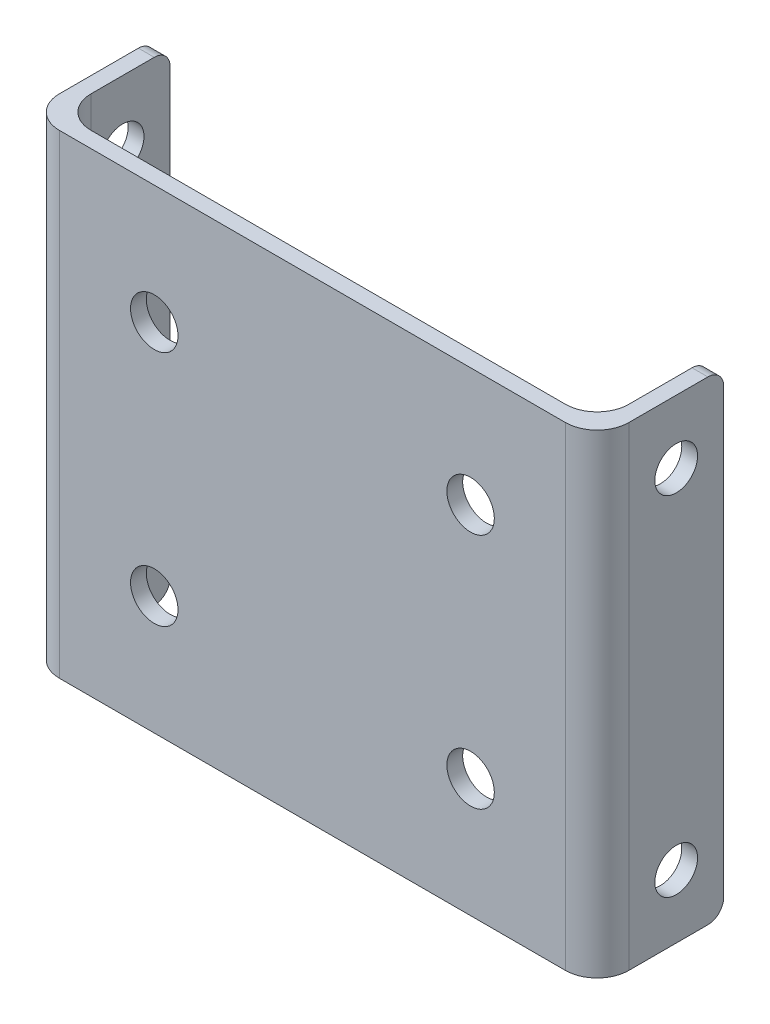
ISO-10303-21;
HEADER;
FILE_DESCRIPTION(('STEP AP214'),'2;1');
FILE_NAME('part.step','',(''),(''),'','','');
FILE_SCHEMA(('AUTOMOTIVE_DESIGN { 1 0 10303 214 1 1 1 1 }'));
ENDSEC;
DATA;
#1=APPLICATION_CONTEXT('core data for automotive mechanical design processes');
#2=APPLICATION_PROTOCOL_DEFINITION('international standard','automotive_design',2000,#1);
#3=PRODUCT_CONTEXT('',#1,'mechanical');
#4=PRODUCT('Part','Part','',(#3));
#5=PRODUCT_RELATED_PRODUCT_CATEGORY('part','',(#4));
#6=PRODUCT_DEFINITION_FORMATION('','',#4);
#7=PRODUCT_DEFINITION_CONTEXT('part definition',#1,'design');
#8=PRODUCT_DEFINITION('design','',#6,#7);
#9=PRODUCT_DEFINITION_SHAPE('','',#8);
#10=(LENGTH_UNIT() NAMED_UNIT(*) SI_UNIT(.MILLI.,.METRE.));
#11=(NAMED_UNIT(*) PLANE_ANGLE_UNIT() SI_UNIT($,.RADIAN.));
#12=(NAMED_UNIT(*) SI_UNIT($,.STERADIAN.) SOLID_ANGLE_UNIT());
#13=UNCERTAINTY_MEASURE_WITH_UNIT(LENGTH_MEASURE(1.E-05),#10,'distance_accuracy_value','');
#14=(GEOMETRIC_REPRESENTATION_CONTEXT(3) GLOBAL_UNCERTAINTY_ASSIGNED_CONTEXT((#13)) GLOBAL_UNIT_ASSIGNED_CONTEXT((#10,
#11,#12)) REPRESENTATION_CONTEXT('',''));
#15=CARTESIAN_POINT('',(0.,0.,0.));
#16=DIRECTION('',(0.,0.,1.));
#17=DIRECTION('',(1.,0.,0.));
#18=AXIS2_PLACEMENT_3D('',#15,#16,#17);
#19=CARTESIAN_POINT('',(13.5000000000001,30.,-0.5));
#20=DIRECTION('',(-1.,0.,0.));
#21=DIRECTION('',(0.,0.,1.));
#22=AXIS2_PLACEMENT_3D('',#19,#20,#21);
#23=PLANE('',#22);
#24=CARTESIAN_POINT('',(13.5000000000001,4.,-4.5));
#25=DIRECTION('',(1.,0.,0.));
#26=DIRECTION('',(0.,0.,-1.));
#27=AXIS2_PLACEMENT_3D('',#24,#25,#26);
#28=CIRCLE('',#27,1.35);
#29=CARTESIAN_POINT('',(13.5000000000001,4.,-5.85));
#30=VERTEX_POINT('',#29);
#31=EDGE_CURVE('E448',#30,#30,#28,.T.);
#32=ORIENTED_EDGE('',*,*,#31,.F.);
#33=EDGE_LOOP('',(#32));
#34=FACE_BOUND('',#33,.T.);
#35=CARTESIAN_POINT('',(13.5000000000001,26.,-4.5));
#36=DIRECTION('',(1.,0.,0.));
#37=DIRECTION('',(0.,0.,-1.));
#38=AXIS2_PLACEMENT_3D('',#35,#36,#37);
#39=CIRCLE('',#38,1.35);
#40=CARTESIAN_POINT('',(13.5000000000001,26.,-5.85));
#41=VERTEX_POINT('',#40);
#42=EDGE_CURVE('E449',#41,#41,#39,.T.);
#43=ORIENTED_EDGE('',*,*,#42,.F.);
#44=EDGE_LOOP('',(#43));
#45=FACE_BOUND('',#44,.T.);
#46=DIRECTION('',(0.,0.,-1.));
#47=VECTOR('',#46,1.);
#48=CARTESIAN_POINT('',(13.5000000000001,0.,-0.5));
#49=LINE('',#48,#47);
#50=CARTESIAN_POINT('',(13.5000000000001,0.,-1.5));
#51=VERTEX_POINT('',#50);
#52=CARTESIAN_POINT('',(13.5000000000001,0.,-6.5));
#53=VERTEX_POINT('',#52);
#54=EDGE_CURVE('E275',#51,#53,#49,.T.);
#55=ORIENTED_EDGE('',*,*,#54,.T.);
#56=CARTESIAN_POINT('',(13.5000000000001,1.,-6.5));
#57=DIRECTION('',(-1.,0.,0.));
#58=DIRECTION('',(0.,0.,1.));
#59=AXIS2_PLACEMENT_3D('',#56,#57,#58);
#60=CIRCLE('',#59,1.);
#61=CARTESIAN_POINT('',(13.5000000000001,1.,-7.5));
#62=VERTEX_POINT('',#61);
#63=EDGE_CURVE('E11',#53,#62,#60,.F.);
#64=ORIENTED_EDGE('',*,*,#63,.T.);
#65=DIRECTION('',(0.,-1.,0.));
#66=VECTOR('',#65,1.);
#67=CARTESIAN_POINT('',(13.5000000000001,30.,-7.5));
#68=LINE('',#67,#66);
#69=CARTESIAN_POINT('',(13.5000000000001,29.,-7.5));
#70=VERTEX_POINT('',#69);
#71=EDGE_CURVE('E191',#70,#62,#68,.T.);
#72=ORIENTED_EDGE('',*,*,#71,.F.);
#73=CARTESIAN_POINT('',(13.5000000000001,29.,-6.5));
#74=DIRECTION('',(-1.,0.,0.));
#75=DIRECTION('',(0.,0.,1.));
#76=AXIS2_PLACEMENT_3D('',#73,#74,#75);
#77=CIRCLE('',#76,1.);
#78=CARTESIAN_POINT('',(13.5000000000001,30.,-6.5));
#79=VERTEX_POINT('',#78);
#80=EDGE_CURVE('E42',#70,#79,#77,.F.);
#81=ORIENTED_EDGE('',*,*,#80,.T.);
#82=DIRECTION('',(0.,0.,-1.));
#83=VECTOR('',#82,1.);
#84=CARTESIAN_POINT('',(13.5000000000001,30.,-0.5));
#85=LINE('',#84,#83);
#86=CARTESIAN_POINT('',(13.5000000000001,30.,-1.5));
#87=VERTEX_POINT('',#86);
#88=EDGE_CURVE('E172',#87,#79,#85,.T.);
#89=ORIENTED_EDGE('',*,*,#88,.F.);
#90=DIRECTION('',(0.,-1.,0.));
#91=VECTOR('',#90,1.);
#92=CARTESIAN_POINT('',(13.5000000000001,30.,-1.5));
#93=LINE('',#92,#91);
#94=EDGE_CURVE('E208',#87,#51,#93,.T.);
#95=ORIENTED_EDGE('',*,*,#94,.T.);
#96=EDGE_LOOP('',(#55,#64,#72,#81,#89,#95));
#97=FACE_BOUND('',#96,.T.);
#98=ADVANCED_FACE('F34',(#34,#45,#97),#23,.F.);
#99=CARTESIAN_POINT('',(13.5000000000001,30.,-7.5));
#100=DIRECTION('',(0.,0.,1.));
#101=DIRECTION('',(1.,0.,0.));
#102=AXIS2_PLACEMENT_3D('',#99,#100,#101);
#103=PLANE('',#102);
#104=ORIENTED_EDGE('',*,*,#71,.T.);
#105=DIRECTION('',(-1.,0.,0.));
#106=VECTOR('',#105,1.);
#107=CARTESIAN_POINT('',(13.5000000000001,1.,-7.5));
#108=LINE('',#107,#106);
#109=CARTESIAN_POINT('',(12.5000000000001,1.,-7.5));
#110=VERTEX_POINT('',#109);
#111=EDGE_CURVE('E247',#62,#110,#108,.T.);
#112=ORIENTED_EDGE('',*,*,#111,.T.);
#113=DIRECTION('',(0.,-1.,0.));
#114=VECTOR('',#113,1.);
#115=CARTESIAN_POINT('',(12.5000000000001,30.,-7.5));
#116=LINE('',#115,#114);
#117=CARTESIAN_POINT('',(12.5000000000001,29.,-7.5));
#118=VERTEX_POINT('',#117);
#119=EDGE_CURVE('E188',#118,#110,#116,.T.);
#120=ORIENTED_EDGE('',*,*,#119,.F.);
#121=DIRECTION('',(-1.,0.,0.));
#122=VECTOR('',#121,1.);
#123=CARTESIAN_POINT('',(13.5000000000001,29.,-7.5));
#124=LINE('',#123,#122);
#125=EDGE_CURVE('E54',#118,#70,#124,.F.);
#126=ORIENTED_EDGE('',*,*,#125,.T.);
#127=EDGE_LOOP('',(#104,#112,#120,#126));
#128=FACE_BOUND('',#127,.T.);
#129=ADVANCED_FACE('F265',(#128),#103,.F.);
#130=CARTESIAN_POINT('',(12.5000000000001,30.,-0.5));
#131=DIRECTION('',(1.,0.,0.));
#132=DIRECTION('',(0.,0.,-1.));
#133=AXIS2_PLACEMENT_3D('',#130,#131,#132);
#134=PLANE('',#133);
#135=CARTESIAN_POINT('',(12.5000000000001,4.,-4.5));
#136=DIRECTION('',(1.,0.,0.));
#137=DIRECTION('',(0.,0.,-1.));
#138=AXIS2_PLACEMENT_3D('',#135,#136,#137);
#139=CIRCLE('',#138,1.35);
#140=CARTESIAN_POINT('',(12.5000000000001,4.,-5.85));
#141=VERTEX_POINT('',#140);
#142=EDGE_CURVE('E372',#141,#141,#139,.T.);
#143=ORIENTED_EDGE('',*,*,#142,.T.);
#144=EDGE_LOOP('',(#143));
#145=FACE_BOUND('',#144,.T.);
#146=CARTESIAN_POINT('',(12.5000000000001,26.,-4.5));
#147=DIRECTION('',(1.,0.,0.));
#148=DIRECTION('',(0.,0.,-1.));
#149=AXIS2_PLACEMENT_3D('',#146,#147,#148);
#150=CIRCLE('',#149,1.35);
#151=CARTESIAN_POINT('',(12.5000000000001,26.,-5.85));
#152=VERTEX_POINT('',#151);
#153=EDGE_CURVE('E375',#152,#152,#150,.T.);
#154=ORIENTED_EDGE('',*,*,#153,.T.);
#155=EDGE_LOOP('',(#154));
#156=FACE_BOUND('',#155,.T.);
#157=ORIENTED_EDGE('',*,*,#119,.T.);
#158=CARTESIAN_POINT('',(12.5000000000001,1.,-6.5));
#159=DIRECTION('',(1.,0.,0.));
#160=DIRECTION('',(0.,0.,-1.));
#161=AXIS2_PLACEMENT_3D('',#158,#159,#160);
#162=CIRCLE('',#161,1.);
#163=CARTESIAN_POINT('',(12.5000000000001,0.,-6.5));
#164=VERTEX_POINT('',#163);
#165=EDGE_CURVE('E252',#110,#164,#162,.F.);
#166=ORIENTED_EDGE('',*,*,#165,.T.);
#167=DIRECTION('',(0.,0.,1.));
#168=VECTOR('',#167,1.);
#169=CARTESIAN_POINT('',(12.5000000000001,0.,-0.5));
#170=LINE('',#169,#168);
#171=CARTESIAN_POINT('',(12.5000000000001,0.,-2.5));
#172=VERTEX_POINT('',#171);
#173=EDGE_CURVE('E271',#164,#172,#170,.T.);
#174=ORIENTED_EDGE('',*,*,#173,.T.);
#175=DIRECTION('',(0.,-1.,0.));
#176=VECTOR('',#175,1.);
#177=CARTESIAN_POINT('',(12.5000000000001,30.,-2.5));
#178=LINE('',#177,#176);
#179=CARTESIAN_POINT('',(12.5000000000001,30.,-2.5));
#180=VERTEX_POINT('',#179);
#181=EDGE_CURVE('E211',#172,#180,#178,.F.);
#182=ORIENTED_EDGE('',*,*,#181,.T.);
#183=DIRECTION('',(0.,0.,1.));
#184=VECTOR('',#183,1.);
#185=CARTESIAN_POINT('',(12.5000000000001,30.,-0.5));
#186=LINE('',#185,#184);
#187=CARTESIAN_POINT('',(12.5000000000001,30.,-6.5));
#188=VERTEX_POINT('',#187);
#189=EDGE_CURVE('E176',#188,#180,#186,.T.);
#190=ORIENTED_EDGE('',*,*,#189,.F.);
#191=CARTESIAN_POINT('',(12.5000000000001,29.,-6.5));
#192=DIRECTION('',(1.,0.,0.));
#193=DIRECTION('',(0.,0.,-1.));
#194=AXIS2_PLACEMENT_3D('',#191,#192,#193);
#195=CIRCLE('',#194,1.);
#196=EDGE_CURVE('E250',#188,#118,#195,.F.);
#197=ORIENTED_EDGE('',*,*,#196,.T.);
#198=EDGE_LOOP('',(#157,#166,#174,#182,#190,#197));
#199=FACE_BOUND('',#198,.T.);
#200=ADVANCED_FACE('F264',(#145,#156,#199),#134,.F.);
#201=CARTESIAN_POINT('',(-21.4999999999999,30.,-0.500000000000001));
#202=DIRECTION('',(0.,0.,1.));
#203=DIRECTION('',(1.,0.,0.));
#204=AXIS2_PLACEMENT_3D('',#201,#202,#203);
#205=PLANE('',#204);
#206=CARTESIAN_POINT('',(-14.4999999999999,7.5,-0.500000000000001));
#207=DIRECTION('',(0.,0.,1.));
#208=DIRECTION('',(1.,0.,0.));
#209=AXIS2_PLACEMENT_3D('',#206,#207,#208);
#210=CIRCLE('',#209,1.5);
#211=CARTESIAN_POINT('',(-12.9999999999999,7.5,-0.500000000000001));
#212=VERTEX_POINT('',#211);
#213=EDGE_CURVE('E381',#212,#212,#210,.T.);
#214=ORIENTED_EDGE('',*,*,#213,.T.);
#215=EDGE_LOOP('',(#214));
#216=FACE_BOUND('',#215,.T.);
#217=CARTESIAN_POINT('',(5.50000000000006,7.5,-0.5));
#218=DIRECTION('',(0.,0.,1.));
#219=DIRECTION('',(1.,0.,0.));
#220=AXIS2_PLACEMENT_3D('',#217,#218,#219);
#221=CIRCLE('',#220,1.5);
#222=CARTESIAN_POINT('',(7.00000000000006,7.5,-0.5));
#223=VERTEX_POINT('',#222);
#224=EDGE_CURVE('E393',#223,#223,#221,.T.);
#225=ORIENTED_EDGE('',*,*,#224,.T.);
#226=EDGE_LOOP('',(#225));
#227=FACE_BOUND('',#226,.T.);
#228=CARTESIAN_POINT('',(5.50000000000006,22.5,-0.5));
#229=DIRECTION('',(0.,0.,1.));
#230=DIRECTION('',(1.,0.,0.));
#231=AXIS2_PLACEMENT_3D('',#228,#229,#230);
#232=CIRCLE('',#231,1.5);
#233=CARTESIAN_POINT('',(7.00000000000005,22.5,-0.5));
#234=VERTEX_POINT('',#233);
#235=EDGE_CURVE('E399',#234,#234,#232,.T.);
#236=ORIENTED_EDGE('',*,*,#235,.T.);
#237=EDGE_LOOP('',(#236));
#238=FACE_BOUND('',#237,.T.);
#239=CARTESIAN_POINT('',(-14.4999999999999,22.5,-0.500000000000001));
#240=DIRECTION('',(0.,0.,1.));
#241=DIRECTION('',(1.,0.,0.));
#242=AXIS2_PLACEMENT_3D('',#239,#240,#241);
#243=CIRCLE('',#242,1.5);
#244=CARTESIAN_POINT('',(-12.9999999999999,22.5,-0.500000000000001));
#245=VERTEX_POINT('',#244);
#246=EDGE_CURVE('E279',#245,#245,#243,.T.);
#247=ORIENTED_EDGE('',*,*,#246,.T.);
#248=EDGE_LOOP('',(#247));
#249=FACE_BOUND('',#248,.T.);
#250=DIRECTION('',(-1.,0.,0.));
#251=VECTOR('',#250,1.);
#252=CARTESIAN_POINT('',(-21.4999999999999,0.,-0.500000000000001));
#253=LINE('',#252,#251);
#254=CARTESIAN_POINT('',(10.5000000000001,0.,-0.5));
#255=VERTEX_POINT('',#254);
#256=CARTESIAN_POINT('',(-19.4999999999999,0.,-0.500000000000001));
#257=VERTEX_POINT('',#256);
#258=EDGE_CURVE('E274',#255,#257,#253,.T.);
#259=ORIENTED_EDGE('',*,*,#258,.T.);
#260=DIRECTION('',(0.,-1.,0.));
#261=VECTOR('',#260,1.);
#262=CARTESIAN_POINT('',(-19.4999999999999,30.,-0.500000000000001));
#263=LINE('',#262,#261);
#264=CARTESIAN_POINT('',(-19.4999999999999,30.,-0.500000000000001));
#265=VERTEX_POINT('',#264);
#266=EDGE_CURVE('E206',#257,#265,#263,.F.);
#267=ORIENTED_EDGE('',*,*,#266,.T.);
#268=DIRECTION('',(-1.,0.,0.));
#269=VECTOR('',#268,1.);
#270=CARTESIAN_POINT('',(-21.4999999999999,30.,-0.500000000000001));
#271=LINE('',#270,#269);
#272=CARTESIAN_POINT('',(10.5000000000001,30.,-0.5));
#273=VERTEX_POINT('',#272);
#274=EDGE_CURVE('E309',#273,#265,#271,.T.);
#275=ORIENTED_EDGE('',*,*,#274,.F.);
#276=DIRECTION('',(0.,-1.,0.));
#277=VECTOR('',#276,1.);
#278=CARTESIAN_POINT('',(10.5000000000001,0.,-0.5));
#279=LINE('',#278,#277);
#280=EDGE_CURVE('E203',#273,#255,#279,.T.);
#281=ORIENTED_EDGE('',*,*,#280,.T.);
#282=EDGE_LOOP('',(#259,#267,#275,#281));
#283=FACE_BOUND('',#282,.T.);
#284=ADVANCED_FACE('F361',(#216,#227,#238,#249,#283),#205,.F.);
#285=CARTESIAN_POINT('',(-21.4999999999999,30.,-0.500000000000001));
#286=DIRECTION('',(-1.,0.,0.));
#287=DIRECTION('',(0.,0.,1.));
#288=AXIS2_PLACEMENT_3D('',#285,#286,#287);
#289=PLANE('',#288);
#290=CARTESIAN_POINT('',(-21.4999999999999,4.,-4.5));
#291=DIRECTION('',(-1.,0.,0.));
#292=DIRECTION('',(0.,0.,1.));
#293=AXIS2_PLACEMENT_3D('',#290,#291,#292);
#294=CIRCLE('',#293,1.35);
#295=CARTESIAN_POINT('',(-21.4999999999999,4.,-3.15));
#296=VERTEX_POINT('',#295);
#297=EDGE_CURVE('E450',#296,#296,#294,.T.);
#298=ORIENTED_EDGE('',*,*,#297,.T.);
#299=EDGE_LOOP('',(#298));
#300=FACE_BOUND('',#299,.T.);
#301=CARTESIAN_POINT('',(-21.4999999999999,26.,-4.5));
#302=DIRECTION('',(-1.,0.,0.));
#303=DIRECTION('',(0.,0.,1.));
#304=AXIS2_PLACEMENT_3D('',#301,#302,#303);
#305=CIRCLE('',#304,1.35);
#306=CARTESIAN_POINT('',(-21.4999999999999,26.,-3.15));
#307=VERTEX_POINT('',#306);
#308=EDGE_CURVE('E378',#307,#307,#305,.T.);
#309=ORIENTED_EDGE('',*,*,#308,.T.);
#310=EDGE_LOOP('',(#309));
#311=FACE_BOUND('',#310,.T.);
#312=DIRECTION('',(0.,-1.,0.));
#313=VECTOR('',#312,1.);
#314=CARTESIAN_POINT('',(-21.4999999999999,30.,-7.5));
#315=LINE('',#314,#313);
#316=CARTESIAN_POINT('',(-21.4999999999999,29.,-7.5));
#317=VERTEX_POINT('',#316);
#318=CARTESIAN_POINT('',(-21.4999999999999,1.,-7.5));
#319=VERTEX_POINT('',#318);
#320=EDGE_CURVE('E185',#317,#319,#315,.T.);
#321=ORIENTED_EDGE('',*,*,#320,.F.);
#322=CARTESIAN_POINT('',(-21.4999999999999,29.,-6.5));
#323=DIRECTION('',(-1.,0.,0.));
#324=DIRECTION('',(0.,0.,1.));
#325=AXIS2_PLACEMENT_3D('',#322,#323,#324);
#326=CIRCLE('',#325,1.);
#327=CARTESIAN_POINT('',(-21.4999999999999,30.,-6.49999999999999));
#328=VERTEX_POINT('',#327);
#329=EDGE_CURVE('E240',#317,#328,#326,.F.);
#330=ORIENTED_EDGE('',*,*,#329,.T.);
#331=DIRECTION('',(0.,0.,-1.));
#332=VECTOR('',#331,1.);
#333=CARTESIAN_POINT('',(-21.4999999999999,30.,-0.500000000000001));
#334=LINE('',#333,#332);
#335=CARTESIAN_POINT('',(-21.4999999999999,30.,-2.5));
#336=VERTEX_POINT('',#335);
#337=EDGE_CURVE('E306',#336,#328,#334,.T.);
#338=ORIENTED_EDGE('',*,*,#337,.F.);
#339=DIRECTION('',(0.,-1.,0.));
#340=VECTOR('',#339,1.);
#341=CARTESIAN_POINT('',(-21.4999999999999,0.,-2.5));
#342=LINE('',#341,#340);
#343=CARTESIAN_POINT('',(-21.4999999999999,0.,-2.5));
#344=VERTEX_POINT('',#343);
#345=EDGE_CURVE('E200',#336,#344,#342,.T.);
#346=ORIENTED_EDGE('',*,*,#345,.T.);
#347=DIRECTION('',(0.,0.,-1.));
#348=VECTOR('',#347,1.);
#349=CARTESIAN_POINT('',(-21.4999999999999,0.,-0.500000000000001));
#350=LINE('',#349,#348);
#351=CARTESIAN_POINT('',(-21.4999999999999,0.,-6.49999999999999));
#352=VERTEX_POINT('',#351);
#353=EDGE_CURVE('E178',#344,#352,#350,.T.);
#354=ORIENTED_EDGE('',*,*,#353,.T.);
#355=CARTESIAN_POINT('',(-21.4999999999999,1.,-6.5));
#356=DIRECTION('',(-1.,0.,0.));
#357=DIRECTION('',(0.,0.,1.));
#358=AXIS2_PLACEMENT_3D('',#355,#356,#357);
#359=CIRCLE('',#358,1.);
#360=EDGE_CURVE('E238',#352,#319,#359,.F.);
#361=ORIENTED_EDGE('',*,*,#360,.T.);
#362=EDGE_LOOP('',(#321,#330,#338,#346,#354,#361));
#363=FACE_BOUND('',#362,.T.);
#364=ADVANCED_FACE('F287',(#300,#311,#363),#289,.F.);
#365=CARTESIAN_POINT('',(-22.4999999999999,30.,-7.5));
#366=DIRECTION('',(0.,0.,1.));
#367=DIRECTION('',(1.,0.,0.));
#368=AXIS2_PLACEMENT_3D('',#365,#366,#367);
#369=PLANE('',#368);
#370=DIRECTION('',(0.,-1.,0.));
#371=VECTOR('',#370,1.);
#372=CARTESIAN_POINT('',(-22.4999999999999,30.,-7.5));
#373=LINE('',#372,#371);
#374=CARTESIAN_POINT('',(-22.4999999999999,29.,-7.5));
#375=VERTEX_POINT('',#374);
#376=CARTESIAN_POINT('',(-22.4999999999999,1.,-7.5));
#377=VERTEX_POINT('',#376);
#378=EDGE_CURVE('E182',#375,#377,#373,.T.);
#379=ORIENTED_EDGE('',*,*,#378,.F.);
#380=DIRECTION('',(-1.,0.,0.));
#381=VECTOR('',#380,1.);
#382=CARTESIAN_POINT('',(-21.4999999999999,29.,-7.5));
#383=LINE('',#382,#381);
#384=EDGE_CURVE('E236',#375,#317,#383,.F.);
#385=ORIENTED_EDGE('',*,*,#384,.T.);
#386=ORIENTED_EDGE('',*,*,#320,.T.);
#387=DIRECTION('',(-1.,0.,0.));
#388=VECTOR('',#387,1.);
#389=CARTESIAN_POINT('',(-22.4999999999999,1.,-7.5));
#390=LINE('',#389,#388);
#391=EDGE_CURVE('E233',#319,#377,#390,.T.);
#392=ORIENTED_EDGE('',*,*,#391,.T.);
#393=EDGE_LOOP('',(#379,#385,#386,#392));
#394=FACE_BOUND('',#393,.T.);
#395=ADVANCED_FACE('F296',(#394),#369,.F.);
#396=CARTESIAN_POINT('',(-22.4999999999999,30.,-0.499999999999996));
#397=DIRECTION('',(1.,0.,0.));
#398=DIRECTION('',(0.,0.,-1.));
#399=AXIS2_PLACEMENT_3D('',#396,#397,#398);
#400=PLANE('',#399);
#401=CARTESIAN_POINT('',(-22.4999999999999,4.,-4.5));
#402=DIRECTION('',(1.,0.,0.));
#403=DIRECTION('',(0.,0.,-1.));
#404=AXIS2_PLACEMENT_3D('',#401,#402,#403);
#405=CIRCLE('',#404,1.35);
#406=CARTESIAN_POINT('',(-22.4999999999999,4.,-5.85));
#407=VERTEX_POINT('',#406);
#408=EDGE_CURVE('E454',#407,#407,#405,.T.);
#409=ORIENTED_EDGE('',*,*,#408,.T.);
#410=EDGE_LOOP('',(#409));
#411=FACE_BOUND('',#410,.T.);
#412=CARTESIAN_POINT('',(-22.4999999999999,26.,-4.5));
#413=DIRECTION('',(1.,0.,0.));
#414=DIRECTION('',(0.,0.,-1.));
#415=AXIS2_PLACEMENT_3D('',#412,#413,#414);
#416=CIRCLE('',#415,1.35);
#417=CARTESIAN_POINT('',(-22.4999999999999,26.,-5.85));
#418=VERTEX_POINT('',#417);
#419=EDGE_CURVE('E384',#418,#418,#416,.T.);
#420=ORIENTED_EDGE('',*,*,#419,.T.);
#421=EDGE_LOOP('',(#420));
#422=FACE_BOUND('',#421,.T.);
#423=DIRECTION('',(0.,0.,1.));
#424=VECTOR('',#423,1.);
#425=CARTESIAN_POINT('',(-22.4999999999999,30.,-0.499999999999996));
#426=LINE('',#425,#424);
#427=CARTESIAN_POINT('',(-22.4999999999999,30.,-6.5));
#428=VERTEX_POINT('',#427);
#429=CARTESIAN_POINT('',(-22.4999999999999,30.,-1.5));
#430=VERTEX_POINT('',#429);
#431=EDGE_CURVE('E301',#428,#430,#426,.T.);
#432=ORIENTED_EDGE('',*,*,#431,.F.);
#433=CARTESIAN_POINT('',(-22.4999999999999,29.,-6.5));
#434=DIRECTION('',(1.,0.,0.));
#435=DIRECTION('',(0.,0.,-1.));
#436=AXIS2_PLACEMENT_3D('',#433,#434,#435);
#437=CIRCLE('',#436,1.);
#438=EDGE_CURVE('E231',#428,#375,#437,.F.);
#439=ORIENTED_EDGE('',*,*,#438,.T.);
#440=ORIENTED_EDGE('',*,*,#378,.T.);
#441=CARTESIAN_POINT('',(-22.4999999999999,1.,-6.5));
#442=DIRECTION('',(1.,0.,0.));
#443=DIRECTION('',(0.,0.,-1.));
#444=AXIS2_PLACEMENT_3D('',#441,#442,#443);
#445=CIRCLE('',#444,1.);
#446=CARTESIAN_POINT('',(-22.4999999999999,0.,-6.5));
#447=VERTEX_POINT('',#446);
#448=EDGE_CURVE('E229',#377,#447,#445,.F.);
#449=ORIENTED_EDGE('',*,*,#448,.T.);
#450=DIRECTION('',(0.,0.,1.));
#451=VECTOR('',#450,1.);
#452=CARTESIAN_POINT('',(-22.4999999999999,0.,-0.499999999999996));
#453=LINE('',#452,#451);
#454=CARTESIAN_POINT('',(-22.4999999999999,0.,-1.5));
#455=VERTEX_POINT('',#454);
#456=EDGE_CURVE('E173',#447,#455,#453,.T.);
#457=ORIENTED_EDGE('',*,*,#456,.T.);
#458=DIRECTION('',(0.,-1.,0.));
#459=VECTOR('',#458,1.);
#460=CARTESIAN_POINT('',(-22.4999999999999,30.,-1.5));
#461=LINE('',#460,#459);
#462=EDGE_CURVE('E154',#455,#430,#461,.F.);
#463=ORIENTED_EDGE('',*,*,#462,.T.);
#464=EDGE_LOOP('',(#432,#439,#440,#449,#457,#463));
#465=FACE_BOUND('',#464,.T.);
#466=ADVANCED_FACE('F300',(#411,#422,#465),#400,.F.);
#467=CARTESIAN_POINT('',(-22.4999999999999,30.,0.499999999999999));
#468=DIRECTION('',(0.,0.,-1.));
#469=DIRECTION('',(-1.,0.,0.));
#470=AXIS2_PLACEMENT_3D('',#467,#468,#469);
#471=PLANE('',#470);
#472=CARTESIAN_POINT('',(-14.4999999999999,7.5,0.499999999999999));
#473=DIRECTION('',(0.,0.,1.));
#474=DIRECTION('',(1.,0.,0.));
#475=AXIS2_PLACEMENT_3D('',#472,#473,#474);
#476=CIRCLE('',#475,1.5);
#477=CARTESIAN_POINT('',(-12.9999999999999,7.5,0.499999999999999));
#478=VERTEX_POINT('',#477);
#479=EDGE_CURVE('E377',#478,#478,#476,.T.);
#480=ORIENTED_EDGE('',*,*,#479,.F.);
#481=EDGE_LOOP('',(#480));
#482=FACE_BOUND('',#481,.T.);
#483=CARTESIAN_POINT('',(5.50000000000006,7.5,0.499999999999999));
#484=DIRECTION('',(0.,0.,1.));
#485=DIRECTION('',(1.,0.,0.));
#486=AXIS2_PLACEMENT_3D('',#483,#484,#485);
#487=CIRCLE('',#486,1.5);
#488=CARTESIAN_POINT('',(7.00000000000006,7.5,0.499999999999999));
#489=VERTEX_POINT('',#488);
#490=EDGE_CURVE('E390',#489,#489,#487,.T.);
#491=ORIENTED_EDGE('',*,*,#490,.F.);
#492=EDGE_LOOP('',(#491));
#493=FACE_BOUND('',#492,.T.);
#494=CARTESIAN_POINT('',(5.50000000000006,22.5,0.499999999999999));
#495=DIRECTION('',(0.,0.,1.));
#496=DIRECTION('',(1.,0.,0.));
#497=AXIS2_PLACEMENT_3D('',#494,#495,#496);
#498=CIRCLE('',#497,1.5);
#499=CARTESIAN_POINT('',(7.00000000000005,22.5,0.499999999999999));
#500=VERTEX_POINT('',#499);
#501=EDGE_CURVE('E396',#500,#500,#498,.T.);
#502=ORIENTED_EDGE('',*,*,#501,.F.);
#503=EDGE_LOOP('',(#502));
#504=FACE_BOUND('',#503,.T.);
#505=CARTESIAN_POINT('',(-14.4999999999999,22.5,0.499999999999999));
#506=DIRECTION('',(0.,0.,1.));
#507=DIRECTION('',(1.,0.,0.));
#508=AXIS2_PLACEMENT_3D('',#505,#506,#507);
#509=CIRCLE('',#508,1.5);
#510=CARTESIAN_POINT('',(-12.9999999999999,22.5,0.499999999999999));
#511=VERTEX_POINT('',#510);
#512=EDGE_CURVE('E402',#511,#511,#509,.T.);
#513=ORIENTED_EDGE('',*,*,#512,.F.);
#514=EDGE_LOOP('',(#513));
#515=FACE_BOUND('',#514,.T.);
#516=DIRECTION('',(1.,0.,0.));
#517=VECTOR('',#516,1.);
#518=CARTESIAN_POINT('',(-22.4999999999999,30.,0.499999999999999));
#519=LINE('',#518,#517);
#520=CARTESIAN_POINT('',(-20.4999999999999,30.,0.499999999999999));
#521=VERTEX_POINT('',#520);
#522=CARTESIAN_POINT('',(11.5000000000001,30.,0.5));
#523=VERTEX_POINT('',#522);
#524=EDGE_CURVE('E167',#521,#523,#519,.T.);
#525=ORIENTED_EDGE('',*,*,#524,.F.);
#526=DIRECTION('',(0.,-1.,0.));
#527=VECTOR('',#526,1.);
#528=CARTESIAN_POINT('',(-20.4999999999999,30.,0.499999999999999));
#529=LINE('',#528,#527);
#530=CARTESIAN_POINT('',(-20.4999999999999,0.,0.499999999999999));
#531=VERTEX_POINT('',#530);
#532=EDGE_CURVE('E152',#521,#531,#529,.T.);
#533=ORIENTED_EDGE('',*,*,#532,.T.);
#534=DIRECTION('',(1.,0.,0.));
#535=VECTOR('',#534,1.);
#536=CARTESIAN_POINT('',(-22.4999999999999,0.,0.499999999999999));
#537=LINE('',#536,#535);
#538=CARTESIAN_POINT('',(11.5000000000001,0.,0.5));
#539=VERTEX_POINT('',#538);
#540=EDGE_CURVE('E164',#531,#539,#537,.T.);
#541=ORIENTED_EDGE('',*,*,#540,.T.);
#542=DIRECTION('',(0.,-1.,0.));
#543=VECTOR('',#542,1.);
#544=CARTESIAN_POINT('',(11.5000000000001,30.,0.5));
#545=LINE('',#544,#543);
#546=EDGE_CURVE('E168',#539,#523,#545,.F.);
#547=ORIENTED_EDGE('',*,*,#546,.T.);
#548=EDGE_LOOP('',(#525,#533,#541,#547));
#549=FACE_BOUND('',#548,.T.);
#550=ADVANCED_FACE('F163',(#482,#493,#504,#515,#549),#471,.F.);
#551=CARTESIAN_POINT('',(0.,30.,0.));
#552=DIRECTION('',(0.,1.,0.));
#553=DIRECTION('',(0.,0.,1.));
#554=AXIS2_PLACEMENT_3D('',#551,#552,#553);
#555=PLANE('',#554);
#556=ORIENTED_EDGE('',*,*,#337,.T.);
#557=DIRECTION('',(-1.,0.,0.));
#558=VECTOR('',#557,1.);
#559=CARTESIAN_POINT('',(-22.4999999999999,30.,-6.5));
#560=LINE('',#559,#558);
#561=EDGE_CURVE('E226',#328,#428,#560,.T.);
#562=ORIENTED_EDGE('',*,*,#561,.T.);
#563=ORIENTED_EDGE('',*,*,#431,.T.);
#564=CARTESIAN_POINT('',(-20.4999999999999,30.,-1.5));
#565=DIRECTION('',(0.,1.,0.));
#566=DIRECTION('',(0.,0.,1.));
#567=AXIS2_PLACEMENT_3D('',#564,#565,#566);
#568=CIRCLE('',#567,2.);
#569=EDGE_CURVE('E198',#430,#521,#568,.T.);
#570=ORIENTED_EDGE('',*,*,#569,.T.);
#571=ORIENTED_EDGE('',*,*,#524,.T.);
#572=CARTESIAN_POINT('',(11.5000000000001,30.,-1.5));
#573=DIRECTION('',(0.,1.,0.));
#574=DIRECTION('',(0.,0.,1.));
#575=AXIS2_PLACEMENT_3D('',#572,#573,#574);
#576=CIRCLE('',#575,2.);
#577=EDGE_CURVE('E196',#523,#87,#576,.T.);
#578=ORIENTED_EDGE('',*,*,#577,.T.);
#579=ORIENTED_EDGE('',*,*,#88,.T.);
#580=DIRECTION('',(-1.,0.,0.));
#581=VECTOR('',#580,1.);
#582=CARTESIAN_POINT('',(12.5000000000001,30.,-6.5));
#583=LINE('',#582,#581);
#584=EDGE_CURVE('E223',#79,#188,#583,.T.);
#585=ORIENTED_EDGE('',*,*,#584,.T.);
#586=ORIENTED_EDGE('',*,*,#189,.T.);
#587=CARTESIAN_POINT('',(10.5000000000001,30.,-2.5));
#588=DIRECTION('',(0.,1.,0.));
#589=DIRECTION('',(0.,0.,1.));
#590=AXIS2_PLACEMENT_3D('',#587,#588,#589);
#591=CIRCLE('',#590,2.);
#592=EDGE_CURVE('E221',#180,#273,#591,.F.);
#593=ORIENTED_EDGE('',*,*,#592,.T.);
#594=ORIENTED_EDGE('',*,*,#274,.T.);
#595=CARTESIAN_POINT('',(-19.4999999999999,30.,-2.5));
#596=DIRECTION('',(0.,1.,0.));
#597=DIRECTION('',(0.,0.,1.));
#598=AXIS2_PLACEMENT_3D('',#595,#596,#597);
#599=CIRCLE('',#598,2.);
#600=EDGE_CURVE('E216',#265,#336,#599,.F.);
#601=ORIENTED_EDGE('',*,*,#600,.T.);
#602=EDGE_LOOP('',(#556,#562,#563,#570,#571,#578,#579,#585,#586,#593,#594,#601));
#603=FACE_BOUND('',#602,.T.);
#604=ADVANCED_FACE('F260',(#603),#555,.T.);
#605=CARTESIAN_POINT('',(0.,0.,0.));
#606=DIRECTION('',(0.,1.,0.));
#607=DIRECTION('',(0.,0.,1.));
#608=AXIS2_PLACEMENT_3D('',#605,#606,#607);
#609=PLANE('',#608);
#610=ORIENTED_EDGE('',*,*,#456,.F.);
#611=DIRECTION('',(-1.,0.,0.));
#612=VECTOR('',#611,1.);
#613=CARTESIAN_POINT('',(0.,0.,-6.5));
#614=LINE('',#613,#612);
#615=EDGE_CURVE('E244',#447,#352,#614,.F.);
#616=ORIENTED_EDGE('',*,*,#615,.T.);
#617=ORIENTED_EDGE('',*,*,#353,.F.);
#618=CARTESIAN_POINT('',(-19.4999999999999,0.,-2.5));
#619=DIRECTION('',(0.,1.,0.));
#620=DIRECTION('',(0.,0.,1.));
#621=AXIS2_PLACEMENT_3D('',#618,#619,#620);
#622=CIRCLE('',#621,2.);
#623=EDGE_CURVE('E214',#344,#257,#622,.T.);
#624=ORIENTED_EDGE('',*,*,#623,.T.);
#625=ORIENTED_EDGE('',*,*,#258,.F.);
#626=CARTESIAN_POINT('',(10.5000000000001,0.,-2.5));
#627=DIRECTION('',(0.,1.,0.));
#628=DIRECTION('',(0.,0.,1.));
#629=AXIS2_PLACEMENT_3D('',#626,#627,#628);
#630=CIRCLE('',#629,2.);
#631=EDGE_CURVE('E218',#255,#172,#630,.T.);
#632=ORIENTED_EDGE('',*,*,#631,.T.);
#633=ORIENTED_EDGE('',*,*,#173,.F.);
#634=DIRECTION('',(-1.,0.,0.));
#635=VECTOR('',#634,1.);
#636=CARTESIAN_POINT('',(0.,0.,-6.49999999999999));
#637=LINE('',#636,#635);
#638=EDGE_CURVE('E242',#164,#53,#637,.F.);
#639=ORIENTED_EDGE('',*,*,#638,.T.);
#640=ORIENTED_EDGE('',*,*,#54,.F.);
#641=CARTESIAN_POINT('',(11.5000000000001,0.,-1.5));
#642=DIRECTION('',(0.,1.,0.));
#643=DIRECTION('',(0.,0.,1.));
#644=AXIS2_PLACEMENT_3D('',#641,#642,#643);
#645=CIRCLE('',#644,2.);
#646=EDGE_CURVE('E158',#51,#539,#645,.F.);
#647=ORIENTED_EDGE('',*,*,#646,.T.);
#648=ORIENTED_EDGE('',*,*,#540,.F.);
#649=CARTESIAN_POINT('',(-20.4999999999999,0.,-1.5));
#650=DIRECTION('',(0.,1.,0.));
#651=DIRECTION('',(0.,0.,1.));
#652=AXIS2_PLACEMENT_3D('',#649,#650,#651);
#653=CIRCLE('',#652,2.);
#654=EDGE_CURVE('E148',#531,#455,#653,.F.);
#655=ORIENTED_EDGE('',*,*,#654,.T.);
#656=EDGE_LOOP('',(#610,#616,#617,#624,#625,#632,#633,#639,#640,#647,#648,#655));
#657=FACE_BOUND('',#656,.T.);
#658=ADVANCED_FACE('F170',(#657),#609,.F.);
#659=CARTESIAN_POINT('',(-20.4999999999999,30.,-1.5));
#660=DIRECTION('',(0.,-1.,0.));
#661=DIRECTION('',(0.,0.,-1.));
#662=AXIS2_PLACEMENT_3D('',#659,#660,#661);
#663=CYLINDRICAL_SURFACE('',#662,2.);
#664=ORIENTED_EDGE('',*,*,#569,.F.);
#665=ORIENTED_EDGE('',*,*,#462,.F.);
#666=ORIENTED_EDGE('',*,*,#654,.F.);
#667=ORIENTED_EDGE('',*,*,#532,.F.);
#668=EDGE_LOOP('',(#664,#665,#666,#667));
#669=FACE_BOUND('',#668,.T.);
#670=ADVANCED_FACE('F151',(#669),#663,.T.);
#671=CARTESIAN_POINT('',(-19.4999999999999,30.,-2.5));
#672=DIRECTION('',(0.,1.,0.));
#673=DIRECTION('',(0.,0.,1.));
#674=AXIS2_PLACEMENT_3D('',#671,#672,#673);
#675=CYLINDRICAL_SURFACE('',#674,2.);
#676=ORIENTED_EDGE('',*,*,#600,.F.);
#677=ORIENTED_EDGE('',*,*,#266,.F.);
#678=ORIENTED_EDGE('',*,*,#623,.F.);
#679=ORIENTED_EDGE('',*,*,#345,.F.);
#680=EDGE_LOOP('',(#676,#677,#678,#679));
#681=FACE_BOUND('',#680,.T.);
#682=ADVANCED_FACE('F318',(#681),#675,.F.);
#683=CARTESIAN_POINT('',(11.5000000000001,30.,-1.5));
#684=DIRECTION('',(0.,-1.,0.));
#685=DIRECTION('',(0.,0.,-1.));
#686=AXIS2_PLACEMENT_3D('',#683,#684,#685);
#687=CYLINDRICAL_SURFACE('',#686,2.);
#688=ORIENTED_EDGE('',*,*,#577,.F.);
#689=ORIENTED_EDGE('',*,*,#546,.F.);
#690=ORIENTED_EDGE('',*,*,#646,.F.);
#691=ORIENTED_EDGE('',*,*,#94,.F.);
#692=EDGE_LOOP('',(#688,#689,#690,#691));
#693=FACE_BOUND('',#692,.T.);
#694=ADVANCED_FACE('F315',(#693),#687,.T.);
#695=CARTESIAN_POINT('',(10.5000000000001,30.,-2.5));
#696=DIRECTION('',(0.,1.,0.));
#697=DIRECTION('',(0.,0.,1.));
#698=AXIS2_PLACEMENT_3D('',#695,#696,#697);
#699=CYLINDRICAL_SURFACE('',#698,2.);
#700=ORIENTED_EDGE('',*,*,#592,.F.);
#701=ORIENTED_EDGE('',*,*,#181,.F.);
#702=ORIENTED_EDGE('',*,*,#631,.F.);
#703=ORIENTED_EDGE('',*,*,#280,.F.);
#704=EDGE_LOOP('',(#700,#701,#702,#703));
#705=FACE_BOUND('',#704,.T.);
#706=ADVANCED_FACE('F317',(#705),#699,.F.);
#707=CARTESIAN_POINT('',(-14.4999999999999,22.5,-7.5));
#708=DIRECTION('',(0.,0.,1.));
#709=DIRECTION('',(1.,0.,0.));
#710=AXIS2_PLACEMENT_3D('',#707,#708,#709);
#711=CYLINDRICAL_SURFACE('',#710,1.5);
#712=ORIENTED_EDGE('',*,*,#512,.T.);
#713=EDGE_LOOP('',(#712));
#714=FACE_BOUND('',#713,.T.);
#715=ORIENTED_EDGE('',*,*,#246,.F.);
#716=EDGE_LOOP('',(#715));
#717=FACE_BOUND('',#716,.T.);
#718=ADVANCED_FACE('F324',(#714,#717),#711,.F.);
#719=CARTESIAN_POINT('',(5.50000000000006,22.5,-7.5));
#720=DIRECTION('',(0.,0.,1.));
#721=DIRECTION('',(1.,0.,0.));
#722=AXIS2_PLACEMENT_3D('',#719,#720,#721);
#723=CYLINDRICAL_SURFACE('',#722,1.5);
#724=ORIENTED_EDGE('',*,*,#501,.T.);
#725=EDGE_LOOP('',(#724));
#726=FACE_BOUND('',#725,.T.);
#727=ORIENTED_EDGE('',*,*,#235,.F.);
#728=EDGE_LOOP('',(#727));
#729=FACE_BOUND('',#728,.T.);
#730=ADVANCED_FACE('F415',(#726,#729),#723,.F.);
#731=CARTESIAN_POINT('',(5.50000000000006,7.5,-7.5));
#732=DIRECTION('',(0.,0.,1.));
#733=DIRECTION('',(1.,0.,0.));
#734=AXIS2_PLACEMENT_3D('',#731,#732,#733);
#735=CYLINDRICAL_SURFACE('',#734,1.5);
#736=ORIENTED_EDGE('',*,*,#490,.T.);
#737=EDGE_LOOP('',(#736));
#738=FACE_BOUND('',#737,.T.);
#739=ORIENTED_EDGE('',*,*,#224,.F.);
#740=EDGE_LOOP('',(#739));
#741=FACE_BOUND('',#740,.T.);
#742=ADVANCED_FACE('F420',(#738,#741),#735,.F.);
#743=CARTESIAN_POINT('',(-14.4999999999999,7.5,-7.5));
#744=DIRECTION('',(0.,0.,1.));
#745=DIRECTION('',(1.,0.,0.));
#746=AXIS2_PLACEMENT_3D('',#743,#744,#745);
#747=CYLINDRICAL_SURFACE('',#746,1.5);
#748=ORIENTED_EDGE('',*,*,#479,.T.);
#749=EDGE_LOOP('',(#748));
#750=FACE_BOUND('',#749,.T.);
#751=ORIENTED_EDGE('',*,*,#213,.F.);
#752=EDGE_LOOP('',(#751));
#753=FACE_BOUND('',#752,.T.);
#754=ADVANCED_FACE('F426',(#750,#753),#747,.F.);
#755=CARTESIAN_POINT('',(-22.4999999999999,26.,-4.5));
#756=DIRECTION('',(1.,0.,0.));
#757=DIRECTION('',(0.,0.,-1.));
#758=AXIS2_PLACEMENT_3D('',#755,#756,#757);
#759=CYLINDRICAL_SURFACE('',#758,1.35);
#760=ORIENTED_EDGE('',*,*,#419,.F.);
#761=EDGE_LOOP('',(#760));
#762=FACE_BOUND('',#761,.T.);
#763=ORIENTED_EDGE('',*,*,#308,.F.);
#764=EDGE_LOOP('',(#763));
#765=FACE_BOUND('',#764,.T.);
#766=ADVANCED_FACE('F430',(#762,#765),#759,.F.);
#767=ORIENTED_EDGE('',*,*,#42,.T.);
#768=EDGE_LOOP('',(#767));
#769=FACE_BOUND('',#768,.T.);
#770=ORIENTED_EDGE('',*,*,#153,.F.);
#771=EDGE_LOOP('',(#770));
#772=FACE_BOUND('',#771,.T.);
#773=ADVANCED_FACE('F432',(#769,#772),#759,.F.);
#774=CARTESIAN_POINT('',(-22.4999999999999,4.,-4.5));
#775=DIRECTION('',(1.,0.,0.));
#776=DIRECTION('',(0.,0.,-1.));
#777=AXIS2_PLACEMENT_3D('',#774,#775,#776);
#778=CYLINDRICAL_SURFACE('',#777,1.35);
#779=ORIENTED_EDGE('',*,*,#408,.F.);
#780=EDGE_LOOP('',(#779));
#781=FACE_BOUND('',#780,.T.);
#782=ORIENTED_EDGE('',*,*,#297,.F.);
#783=EDGE_LOOP('',(#782));
#784=FACE_BOUND('',#783,.T.);
#785=ADVANCED_FACE('F435',(#781,#784),#778,.F.);
#786=ORIENTED_EDGE('',*,*,#31,.T.);
#787=EDGE_LOOP('',(#786));
#788=FACE_BOUND('',#787,.T.);
#789=ORIENTED_EDGE('',*,*,#142,.F.);
#790=EDGE_LOOP('',(#789));
#791=FACE_BOUND('',#790,.T.);
#792=ADVANCED_FACE('F437',(#788,#791),#778,.F.);
#793=CARTESIAN_POINT('',(0.,29.,-6.5));
#794=DIRECTION('',(1.,0.,0.));
#795=DIRECTION('',(0.,0.,-1.));
#796=AXIS2_PLACEMENT_3D('',#793,#794,#795);
#797=CYLINDRICAL_SURFACE('',#796,1.);
#798=ORIENTED_EDGE('',*,*,#329,.F.);
#799=ORIENTED_EDGE('',*,*,#384,.F.);
#800=ORIENTED_EDGE('',*,*,#438,.F.);
#801=ORIENTED_EDGE('',*,*,#561,.F.);
#802=EDGE_LOOP('',(#798,#799,#800,#801));
#803=FACE_BOUND('',#802,.T.);
#804=ADVANCED_FACE('F305',(#803),#797,.T.);
#805=CARTESIAN_POINT('',(-22.4999999999999,1.,-6.5));
#806=DIRECTION('',(-1.,0.,0.));
#807=DIRECTION('',(0.,0.,1.));
#808=AXIS2_PLACEMENT_3D('',#805,#806,#807);
#809=CYLINDRICAL_SURFACE('',#808,1.);
#810=ORIENTED_EDGE('',*,*,#360,.F.);
#811=ORIENTED_EDGE('',*,*,#615,.F.);
#812=ORIENTED_EDGE('',*,*,#448,.F.);
#813=ORIENTED_EDGE('',*,*,#391,.F.);
#814=EDGE_LOOP('',(#810,#811,#812,#813));
#815=FACE_BOUND('',#814,.T.);
#816=ADVANCED_FACE('F293',(#815),#809,.T.);
#817=CARTESIAN_POINT('',(13.5000000000001,1.,-6.5));
#818=DIRECTION('',(-1.,0.,0.));
#819=DIRECTION('',(0.,0.,1.));
#820=AXIS2_PLACEMENT_3D('',#817,#818,#819);
#821=CYLINDRICAL_SURFACE('',#820,1.);
#822=ORIENTED_EDGE('',*,*,#63,.F.);
#823=ORIENTED_EDGE('',*,*,#638,.F.);
#824=ORIENTED_EDGE('',*,*,#165,.F.);
#825=ORIENTED_EDGE('',*,*,#111,.F.);
#826=EDGE_LOOP('',(#822,#823,#824,#825));
#827=FACE_BOUND('',#826,.T.);
#828=ADVANCED_FACE('F268',(#827),#821,.T.);
#829=CARTESIAN_POINT('',(0.,29.,-6.49999999999999));
#830=DIRECTION('',(1.,0.,0.));
#831=DIRECTION('',(0.,0.,-1.));
#832=AXIS2_PLACEMENT_3D('',#829,#830,#831);
#833=CYLINDRICAL_SURFACE('',#832,1.);
#834=ORIENTED_EDGE('',*,*,#80,.F.);
#835=ORIENTED_EDGE('',*,*,#125,.F.);
#836=ORIENTED_EDGE('',*,*,#196,.F.);
#837=ORIENTED_EDGE('',*,*,#584,.F.);
#838=EDGE_LOOP('',(#834,#835,#836,#837));
#839=FACE_BOUND('',#838,.T.);
#840=ADVANCED_FACE('F36',(#839),#833,.T.);
#841=CLOSED_SHELL('',(#98,#129,#200,#284,#364,#395,#466,#550,#604,#658,#670,#682,#694,#706,#718,
#730,#742,#754,#766,#773,#785,#792,#804,#816,#828,#840));
#842=MANIFOLD_SOLID_BREP('B2',#841);
#843=ADVANCED_BREP_SHAPE_REPRESENTATION('',(#18,#842),#14);
#844=SHAPE_DEFINITION_REPRESENTATION(#9,#843);
ENDSEC;
END-ISO-10303-21;
